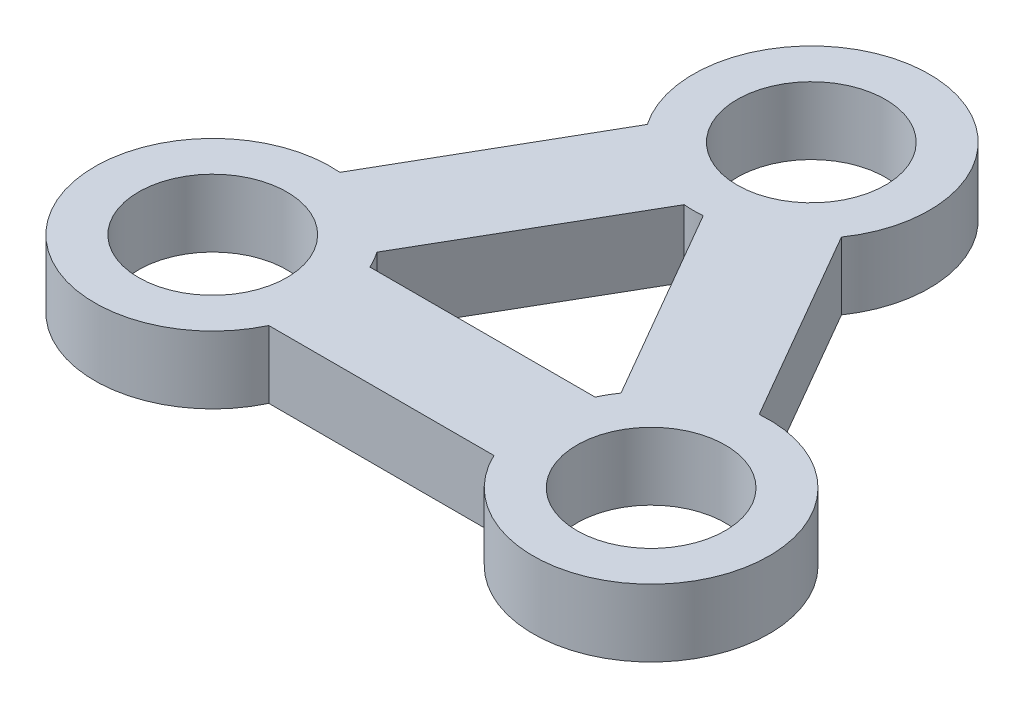
ISO-10303-21;
HEADER;
FILE_DESCRIPTION(('STEP AP214'),'2;1');
FILE_NAME('part.step','',(''),(''),'','','');
FILE_SCHEMA(('AUTOMOTIVE_DESIGN { 1 0 10303 214 1 1 1 1 }'));
ENDSEC;
DATA;
#1=APPLICATION_CONTEXT('core data for automotive mechanical design processes');
#2=APPLICATION_PROTOCOL_DEFINITION('international standard','automotive_design',2000,#1);
#3=PRODUCT_CONTEXT('',#1,'mechanical');
#4=PRODUCT('Part','Part','',(#3));
#5=PRODUCT_RELATED_PRODUCT_CATEGORY('part','',(#4));
#6=PRODUCT_DEFINITION_FORMATION('','',#4);
#7=PRODUCT_DEFINITION_CONTEXT('part definition',#1,'design');
#8=PRODUCT_DEFINITION('design','',#6,#7);
#9=PRODUCT_DEFINITION_SHAPE('','',#8);
#10=(LENGTH_UNIT() NAMED_UNIT(*) SI_UNIT(.MILLI.,.METRE.));
#11=(NAMED_UNIT(*) PLANE_ANGLE_UNIT() SI_UNIT($,.RADIAN.));
#12=(NAMED_UNIT(*) SI_UNIT($,.STERADIAN.) SOLID_ANGLE_UNIT());
#13=UNCERTAINTY_MEASURE_WITH_UNIT(LENGTH_MEASURE(1.E-05),#10,'distance_accuracy_value','');
#14=(GEOMETRIC_REPRESENTATION_CONTEXT(3) GLOBAL_UNCERTAINTY_ASSIGNED_CONTEXT((#13)) GLOBAL_UNIT_ASSIGNED_CONTEXT((#10,
#11,#12)) REPRESENTATION_CONTEXT('',''));
#15=CARTESIAN_POINT('',(0.,0.,0.));
#16=DIRECTION('',(0.,0.,1.));
#17=DIRECTION('',(1.,0.,0.));
#18=AXIS2_PLACEMENT_3D('',#15,#16,#17);
#19=CARTESIAN_POINT('',(0.,20.,0.));
#20=DIRECTION('',(0.,1.,0.));
#21=DIRECTION('',(0.,0.,1.));
#22=AXIS2_PLACEMENT_3D('',#19,#20,#21);
#23=PLANE('',#22);
#24=CARTESIAN_POINT('',(130.,20.,0.));
#25=DIRECTION('',(0.,1.,0.));
#26=DIRECTION('',(0.,0.,1.));
#27=AXIS2_PLACEMENT_3D('',#24,#25,#26);
#28=CIRCLE('',#27,22.);
#29=CARTESIAN_POINT('',(130.,20.,22.));
#30=VERTEX_POINT('',#29);
#31=EDGE_CURVE('E183',#30,#30,#28,.T.);
#32=ORIENTED_EDGE('',*,*,#31,.F.);
#33=EDGE_LOOP('',(#32));
#34=FACE_BOUND('',#33,.T.);
#35=CARTESIAN_POINT('',(0.,20.,0.));
#36=DIRECTION('',(0.,1.,0.));
#37=DIRECTION('',(0.,0.,1.));
#38=AXIS2_PLACEMENT_3D('',#35,#36,#37);
#39=CIRCLE('',#38,35.);
#40=CARTESIAN_POINT('',(2.83219061774813,20.,-34.8852217465324));
#41=VERTEX_POINT('',#40);
#42=CARTESIAN_POINT('',(31.6227766016838,20.,15.));
#43=VERTEX_POINT('',#42);
#44=EDGE_CURVE('E195',#41,#43,#39,.T.);
#45=ORIENTED_EDGE('',*,*,#44,.T.);
#46=DIRECTION('',(1.,0.,0.));
#47=VECTOR('',#46,1.);
#48=CARTESIAN_POINT('',(98.3772233983162,20.,15.));
#49=LINE('',#48,#47);
#50=CARTESIAN_POINT('',(98.3772233983162,20.,15.));
#51=VERTEX_POINT('',#50);
#52=EDGE_CURVE('E198',#43,#51,#49,.T.);
#53=ORIENTED_EDGE('',*,*,#52,.T.);
#54=CARTESIAN_POINT('',(130.,20.,0.));
#55=DIRECTION('',(0.,1.,0.));
#56=DIRECTION('',(0.,0.,1.));
#57=AXIS2_PLACEMENT_3D('',#54,#55,#56);
#58=CIRCLE('',#57,35.);
#59=CARTESIAN_POINT('',(127.167809382252,20.,-34.8852217465324));
#60=VERTEX_POINT('',#59);
#61=EDGE_CURVE('E201',#51,#60,#58,.T.);
#62=ORIENTED_EDGE('',*,*,#61,.T.);
#63=DIRECTION('',(-0.500277597874629,0.,-0.865865073244551));
#64=VECTOR('',#63,1.);
#65=CARTESIAN_POINT('',(93.8081428150846,20.,-92.6231061897065));
#66=LINE('',#65,#64);
#67=CARTESIAN_POINT('',(93.8081428150847,20.,-92.6231061897064));
#68=VERTEX_POINT('',#67);
#69=EDGE_CURVE('E203',#60,#68,#66,.T.);
#70=ORIENTED_EDGE('',*,*,#69,.T.);
#71=CARTESIAN_POINT('',(65.,20.,-112.5));
#72=DIRECTION('',(0.,1.,0.));
#73=DIRECTION('',(0.,0.,1.));
#74=AXIS2_PLACEMENT_3D('',#71,#72,#73);
#75=CIRCLE('',#74,35.);
#76=CARTESIAN_POINT('',(36.0973000328435,20.,-92.7608527385671));
#77=VERTEX_POINT('',#76);
#78=EDGE_CURVE('E205',#68,#77,#75,.T.);
#79=ORIENTED_EDGE('',*,*,#78,.T.);
#80=DIRECTION('',(-0.498320501650439,0.,0.866992893647263));
#81=VECTOR('',#80,1.);
#82=CARTESIAN_POINT('',(2.83219061774813,20.,-34.8852217465324));
#83=LINE('',#82,#81);
#84=EDGE_CURVE('E207',#77,#41,#83,.T.);
#85=ORIENTED_EDGE('',*,*,#84,.T.);
#86=EDGE_LOOP('',(#45,#53,#62,#70,#79,#85));
#87=FACE_BOUND('',#86,.T.);
#88=CARTESIAN_POINT('',(0.,20.,0.));
#89=DIRECTION('',(0.,1.,0.));
#90=DIRECTION('',(0.,0.,1.));
#91=AXIS2_PLACEMENT_3D('',#88,#89,#90);
#92=CIRCLE('',#91,22.);
#93=CARTESIAN_POINT('',(0.,20.,22.));
#94=VERTEX_POINT('',#93);
#95=EDGE_CURVE('E189',#94,#94,#92,.T.);
#96=ORIENTED_EDGE('',*,*,#95,.F.);
#97=EDGE_LOOP('',(#96));
#98=FACE_BOUND('',#97,.T.);
#99=CARTESIAN_POINT('',(65.,20.,-112.5));
#100=DIRECTION('',(0.,1.,0.));
#101=DIRECTION('',(0.,0.,1.));
#102=AXIS2_PLACEMENT_3D('',#99,#100,#101);
#103=CIRCLE('',#102,22.);
#104=CARTESIAN_POINT('',(65.,20.,-90.5));
#105=VERTEX_POINT('',#104);
#106=EDGE_CURVE('E177',#105,#105,#103,.T.);
#107=ORIENTED_EDGE('',*,*,#106,.F.);
#108=EDGE_LOOP('',(#107));
#109=FACE_BOUND('',#108,.T.);
#110=DIRECTION('',(1.,0.,0.));
#111=VECTOR('',#110,1.);
#112=CARTESIAN_POINT('',(98.3772233983162,20.,-15.));
#113=LINE('',#112,#111);
#114=CARTESIAN_POINT('',(31.6227766016838,20.,-15.));
#115=VERTEX_POINT('',#114);
#116=CARTESIAN_POINT('',(98.3772233983162,20.,-15.));
#117=VERTEX_POINT('',#116);
#118=EDGE_CURVE('E134',#115,#117,#113,.T.);
#119=ORIENTED_EDGE('',*,*,#118,.F.);
#120=CARTESIAN_POINT('',(0.,20.,0.));
#121=DIRECTION('',(0.,-1.,0.));
#122=DIRECTION('',(0.,0.,1.));
#123=AXIS2_PLACEMENT_3D('',#120,#121,#122);
#124=CIRCLE('',#123,35.);
#125=CARTESIAN_POINT('',(28.8081428150847,20.,-19.8768938102936));
#126=VERTEX_POINT('',#125);
#127=EDGE_CURVE('E126',#126,#115,#124,.T.);
#128=ORIENTED_EDGE('',*,*,#127,.F.);
#129=DIRECTION('',(-0.500277597874629,0.,0.865865073244551));
#130=VECTOR('',#129,1.);
#131=CARTESIAN_POINT('',(28.8081428150847,20.,-19.8768938102936));
#132=LINE('',#131,#130);
#133=CARTESIAN_POINT('',(62.1678093822518,20.,-77.6147782534676));
#134=VERTEX_POINT('',#133);
#135=EDGE_CURVE('E155',#134,#126,#132,.T.);
#136=ORIENTED_EDGE('',*,*,#135,.F.);
#137=CARTESIAN_POINT('',(65.,20.,-112.5));
#138=DIRECTION('',(0.,-1.,0.));
#139=DIRECTION('',(0.,0.,1.));
#140=AXIS2_PLACEMENT_3D('',#137,#138,#139);
#141=CIRCLE('',#140,35.);
#142=CARTESIAN_POINT('',(67.8321906177481,20.,-77.6147782534676));
#143=VERTEX_POINT('',#142);
#144=EDGE_CURVE('E153',#143,#134,#141,.T.);
#145=ORIENTED_EDGE('',*,*,#144,.F.);
#146=DIRECTION('',(-0.500277597874629,0.,-0.86586507324455));
#147=VECTOR('',#146,1.);
#148=CARTESIAN_POINT('',(67.8321906177481,20.,-77.6147782534676));
#149=LINE('',#148,#147);
#150=CARTESIAN_POINT('',(101.191857184915,20.,-19.8768938102936));
#151=VERTEX_POINT('',#150);
#152=EDGE_CURVE('E149',#151,#143,#149,.T.);
#153=ORIENTED_EDGE('',*,*,#152,.F.);
#154=CARTESIAN_POINT('',(130.,20.,0.));
#155=DIRECTION('',(0.,-1.,0.));
#156=DIRECTION('',(0.,0.,1.));
#157=AXIS2_PLACEMENT_3D('',#154,#155,#156);
#158=CIRCLE('',#157,35.);
#159=EDGE_CURVE('E147',#117,#151,#158,.T.);
#160=ORIENTED_EDGE('',*,*,#159,.F.);
#161=EDGE_LOOP('',(#119,#128,#136,#145,#153,#160));
#162=FACE_BOUND('',#161,.T.);
#163=ADVANCED_FACE('F37',(#34,#87,#98,#109,#162),#23,.T.);
#164=CARTESIAN_POINT('',(0.,0.,0.));
#165=DIRECTION('',(0.,1.,0.));
#166=DIRECTION('',(0.,0.,1.));
#167=AXIS2_PLACEMENT_3D('',#164,#165,#166);
#168=PLANE('',#167);
#169=CARTESIAN_POINT('',(65.,0.,-112.5));
#170=DIRECTION('',(0.,1.,0.));
#171=DIRECTION('',(0.,0.,1.));
#172=AXIS2_PLACEMENT_3D('',#169,#170,#171);
#173=CIRCLE('',#172,22.);
#174=CARTESIAN_POINT('',(65.,0.,-90.5));
#175=VERTEX_POINT('',#174);
#176=EDGE_CURVE('E142',#175,#175,#173,.T.);
#177=ORIENTED_EDGE('',*,*,#176,.T.);
#178=EDGE_LOOP('',(#177));
#179=FACE_BOUND('',#178,.T.);
#180=CARTESIAN_POINT('',(130.,0.,0.));
#181=DIRECTION('',(0.,1.,0.));
#182=DIRECTION('',(0.,0.,1.));
#183=AXIS2_PLACEMENT_3D('',#180,#181,#182);
#184=CIRCLE('',#183,22.);
#185=CARTESIAN_POINT('',(130.,0.,22.));
#186=VERTEX_POINT('',#185);
#187=EDGE_CURVE('E180',#186,#186,#184,.T.);
#188=ORIENTED_EDGE('',*,*,#187,.T.);
#189=EDGE_LOOP('',(#188));
#190=FACE_BOUND('',#189,.T.);
#191=CARTESIAN_POINT('',(0.,0.,0.));
#192=DIRECTION('',(0.,1.,0.));
#193=DIRECTION('',(0.,0.,1.));
#194=AXIS2_PLACEMENT_3D('',#191,#192,#193);
#195=CIRCLE('',#194,22.);
#196=CARTESIAN_POINT('',(0.,0.,22.));
#197=VERTEX_POINT('',#196);
#198=EDGE_CURVE('E186',#197,#197,#195,.T.);
#199=ORIENTED_EDGE('',*,*,#198,.T.);
#200=EDGE_LOOP('',(#199));
#201=FACE_BOUND('',#200,.T.);
#202=CARTESIAN_POINT('',(0.,0.,0.));
#203=DIRECTION('',(0.,1.,0.));
#204=DIRECTION('',(0.,0.,1.));
#205=AXIS2_PLACEMENT_3D('',#202,#203,#204);
#206=CIRCLE('',#205,35.);
#207=CARTESIAN_POINT('',(2.83219061774813,0.,-34.8852217465324));
#208=VERTEX_POINT('',#207);
#209=CARTESIAN_POINT('',(31.6227766016838,0.,15.));
#210=VERTEX_POINT('',#209);
#211=EDGE_CURVE('E192',#208,#210,#206,.T.);
#212=ORIENTED_EDGE('',*,*,#211,.F.);
#213=DIRECTION('',(-0.498320501650439,0.,0.866992893647263));
#214=VECTOR('',#213,1.);
#215=CARTESIAN_POINT('',(2.83219061774813,0.,-34.8852217465324));
#216=LINE('',#215,#214);
#217=CARTESIAN_POINT('',(36.0973000328435,0.,-92.7608527385671));
#218=VERTEX_POINT('',#217);
#219=EDGE_CURVE('E199',#218,#208,#216,.T.);
#220=ORIENTED_EDGE('',*,*,#219,.F.);
#221=CARTESIAN_POINT('',(65.,0.,-112.5));
#222=DIRECTION('',(0.,1.,0.));
#223=DIRECTION('',(0.,0.,1.));
#224=AXIS2_PLACEMENT_3D('',#221,#222,#223);
#225=CIRCLE('',#224,35.);
#226=CARTESIAN_POINT('',(93.8081428150847,0.,-92.6231061897064));
#227=VERTEX_POINT('',#226);
#228=EDGE_CURVE('E218',#227,#218,#225,.T.);
#229=ORIENTED_EDGE('',*,*,#228,.F.);
#230=DIRECTION('',(-0.500277597874629,0.,-0.865865073244551));
#231=VECTOR('',#230,1.);
#232=CARTESIAN_POINT('',(93.8081428150846,0.,-92.6231061897065));
#233=LINE('',#232,#231);
#234=CARTESIAN_POINT('',(127.167809382252,0.,-34.8852217465324));
#235=VERTEX_POINT('',#234);
#236=EDGE_CURVE('E216',#235,#227,#233,.T.);
#237=ORIENTED_EDGE('',*,*,#236,.F.);
#238=CARTESIAN_POINT('',(130.,0.,0.));
#239=DIRECTION('',(0.,1.,0.));
#240=DIRECTION('',(0.,0.,1.));
#241=AXIS2_PLACEMENT_3D('',#238,#239,#240);
#242=CIRCLE('',#241,35.);
#243=CARTESIAN_POINT('',(98.3772233983162,0.,15.));
#244=VERTEX_POINT('',#243);
#245=EDGE_CURVE('E214',#244,#235,#242,.T.);
#246=ORIENTED_EDGE('',*,*,#245,.F.);
#247=DIRECTION('',(1.,0.,0.));
#248=VECTOR('',#247,1.);
#249=CARTESIAN_POINT('',(98.3772233983162,0.,15.));
#250=LINE('',#249,#248);
#251=EDGE_CURVE('E212',#210,#244,#250,.T.);
#252=ORIENTED_EDGE('',*,*,#251,.F.);
#253=EDGE_LOOP('',(#212,#220,#229,#237,#246,#252));
#254=FACE_BOUND('',#253,.T.);
#255=CARTESIAN_POINT('',(0.,0.,0.));
#256=DIRECTION('',(0.,-1.,0.));
#257=DIRECTION('',(0.,0.,1.));
#258=AXIS2_PLACEMENT_3D('',#255,#256,#257);
#259=CIRCLE('',#258,35.);
#260=CARTESIAN_POINT('',(28.8081428150847,0.,-19.8768938102936));
#261=VERTEX_POINT('',#260);
#262=CARTESIAN_POINT('',(31.6227766016838,0.,-15.));
#263=VERTEX_POINT('',#262);
#264=EDGE_CURVE('E60',#261,#263,#259,.T.);
#265=ORIENTED_EDGE('',*,*,#264,.T.);
#266=DIRECTION('',(1.,0.,0.));
#267=VECTOR('',#266,1.);
#268=CARTESIAN_POINT('',(98.3772233983162,0.,-15.));
#269=LINE('',#268,#267);
#270=CARTESIAN_POINT('',(98.3772233983162,0.,-15.));
#271=VERTEX_POINT('',#270);
#272=EDGE_CURVE('E141',#263,#271,#269,.T.);
#273=ORIENTED_EDGE('',*,*,#272,.T.);
#274=CARTESIAN_POINT('',(130.,0.,0.));
#275=DIRECTION('',(0.,-1.,0.));
#276=DIRECTION('',(0.,0.,1.));
#277=AXIS2_PLACEMENT_3D('',#274,#275,#276);
#278=CIRCLE('',#277,35.);
#279=CARTESIAN_POINT('',(101.191857184915,0.,-19.8768938102936));
#280=VERTEX_POINT('',#279);
#281=EDGE_CURVE('E159',#271,#280,#278,.T.);
#282=ORIENTED_EDGE('',*,*,#281,.T.);
#283=DIRECTION('',(-0.500277597874629,0.,-0.86586507324455));
#284=VECTOR('',#283,1.);
#285=CARTESIAN_POINT('',(67.8321906177481,0.,-77.6147782534676));
#286=LINE('',#285,#284);
#287=CARTESIAN_POINT('',(67.8321906177481,0.,-77.6147782534676));
#288=VERTEX_POINT('',#287);
#289=EDGE_CURVE('E162',#280,#288,#286,.T.);
#290=ORIENTED_EDGE('',*,*,#289,.T.);
#291=CARTESIAN_POINT('',(65.,0.,-112.5));
#292=DIRECTION('',(0.,-1.,0.));
#293=DIRECTION('',(0.,0.,1.));
#294=AXIS2_PLACEMENT_3D('',#291,#292,#293);
#295=CIRCLE('',#294,35.);
#296=CARTESIAN_POINT('',(62.1678093822518,0.,-77.6147782534676));
#297=VERTEX_POINT('',#296);
#298=EDGE_CURVE('E165',#288,#297,#295,.T.);
#299=ORIENTED_EDGE('',*,*,#298,.T.);
#300=DIRECTION('',(-0.500277597874629,0.,0.865865073244551));
#301=VECTOR('',#300,1.);
#302=CARTESIAN_POINT('',(28.8081428150847,0.,-19.8768938102936));
#303=LINE('',#302,#301);
#304=EDGE_CURVE('E135',#297,#261,#303,.T.);
#305=ORIENTED_EDGE('',*,*,#304,.T.);
#306=EDGE_LOOP('',(#265,#273,#282,#290,#299,#305));
#307=FACE_BOUND('',#306,.T.);
#308=ADVANCED_FACE('F242',(#179,#190,#201,#254,#307),#168,.F.);
#309=CARTESIAN_POINT('',(0.,20.,0.));
#310=DIRECTION('',(0.,-1.,0.));
#311=DIRECTION('',(0.,0.,-1.));
#312=AXIS2_PLACEMENT_3D('',#309,#310,#311);
#313=CYLINDRICAL_SURFACE('',#312,35.);
#314=ORIENTED_EDGE('',*,*,#211,.T.);
#315=DIRECTION('',(0.,-1.,0.));
#316=VECTOR('',#315,1.);
#317=CARTESIAN_POINT('',(31.6227766016838,20.,15.));
#318=LINE('',#317,#316);
#319=EDGE_CURVE('E11',#43,#210,#318,.T.);
#320=ORIENTED_EDGE('',*,*,#319,.F.);
#321=ORIENTED_EDGE('',*,*,#44,.F.);
#322=DIRECTION('',(0.,-1.,0.));
#323=VECTOR('',#322,1.);
#324=CARTESIAN_POINT('',(2.83219061774813,20.,-34.8852217465324));
#325=LINE('',#324,#323);
#326=EDGE_CURVE('E209',#41,#208,#325,.T.);
#327=ORIENTED_EDGE('',*,*,#326,.T.);
#328=EDGE_LOOP('',(#314,#320,#321,#327));
#329=FACE_BOUND('',#328,.T.);
#330=ADVANCED_FACE('F39',(#329),#313,.T.);
#331=CARTESIAN_POINT('',(98.3772233983162,20.,15.));
#332=DIRECTION('',(0.,0.,-1.));
#333=DIRECTION('',(-1.,0.,0.));
#334=AXIS2_PLACEMENT_3D('',#331,#332,#333);
#335=PLANE('',#334);
#336=ORIENTED_EDGE('',*,*,#251,.T.);
#337=DIRECTION('',(0.,-1.,0.));
#338=VECTOR('',#337,1.);
#339=CARTESIAN_POINT('',(98.3772233983162,20.,15.));
#340=LINE('',#339,#338);
#341=EDGE_CURVE('E45',#51,#244,#340,.T.);
#342=ORIENTED_EDGE('',*,*,#341,.F.);
#343=ORIENTED_EDGE('',*,*,#52,.F.);
#344=ORIENTED_EDGE('',*,*,#319,.T.);
#345=EDGE_LOOP('',(#336,#342,#343,#344));
#346=FACE_BOUND('',#345,.T.);
#347=ADVANCED_FACE('F260',(#346),#335,.F.);
#348=CARTESIAN_POINT('',(130.,20.,0.));
#349=DIRECTION('',(0.,-1.,0.));
#350=DIRECTION('',(0.,0.,-1.));
#351=AXIS2_PLACEMENT_3D('',#348,#349,#350);
#352=CYLINDRICAL_SURFACE('',#351,35.);
#353=ORIENTED_EDGE('',*,*,#245,.T.);
#354=DIRECTION('',(0.,-1.,0.));
#355=VECTOR('',#354,1.);
#356=CARTESIAN_POINT('',(127.167809382252,20.,-34.8852217465324));
#357=LINE('',#356,#355);
#358=EDGE_CURVE('E229',#60,#235,#357,.T.);
#359=ORIENTED_EDGE('',*,*,#358,.F.);
#360=ORIENTED_EDGE('',*,*,#61,.F.);
#361=ORIENTED_EDGE('',*,*,#341,.T.);
#362=EDGE_LOOP('',(#353,#359,#360,#361));
#363=FACE_BOUND('',#362,.T.);
#364=ADVANCED_FACE('F236',(#363),#352,.T.);
#365=CARTESIAN_POINT('',(93.8081428150846,20.,-92.6231061897065));
#366=DIRECTION('',(-0.865865073244551,0.,0.500277597874629));
#367=DIRECTION('',(0.500277597874629,0.,0.865865073244551));
#368=AXIS2_PLACEMENT_3D('',#365,#366,#367);
#369=PLANE('',#368);
#370=ORIENTED_EDGE('',*,*,#236,.T.);
#371=DIRECTION('',(0.,-1.,0.));
#372=VECTOR('',#371,1.);
#373=CARTESIAN_POINT('',(93.8081428150847,20.,-92.6231061897064));
#374=LINE('',#373,#372);
#375=EDGE_CURVE('E226',#68,#227,#374,.T.);
#376=ORIENTED_EDGE('',*,*,#375,.F.);
#377=ORIENTED_EDGE('',*,*,#69,.F.);
#378=ORIENTED_EDGE('',*,*,#358,.T.);
#379=EDGE_LOOP('',(#370,#376,#377,#378));
#380=FACE_BOUND('',#379,.T.);
#381=ADVANCED_FACE('F248',(#380),#369,.F.);
#382=CARTESIAN_POINT('',(65.,20.,-112.5));
#383=DIRECTION('',(0.,-1.,0.));
#384=DIRECTION('',(0.,0.,-1.));
#385=AXIS2_PLACEMENT_3D('',#382,#383,#384);
#386=CYLINDRICAL_SURFACE('',#385,35.);
#387=ORIENTED_EDGE('',*,*,#228,.T.);
#388=DIRECTION('',(0.,-1.,0.));
#389=VECTOR('',#388,1.);
#390=CARTESIAN_POINT('',(36.0973000328435,20.,-92.7608527385671));
#391=LINE('',#390,#389);
#392=EDGE_CURVE('E223',#77,#218,#391,.T.);
#393=ORIENTED_EDGE('',*,*,#392,.F.);
#394=ORIENTED_EDGE('',*,*,#78,.F.);
#395=ORIENTED_EDGE('',*,*,#375,.T.);
#396=EDGE_LOOP('',(#387,#393,#394,#395));
#397=FACE_BOUND('',#396,.T.);
#398=ADVANCED_FACE('F252',(#397),#386,.T.);
#399=CARTESIAN_POINT('',(2.83219061774813,20.,-34.8852217465324));
#400=DIRECTION('',(0.866992893647263,0.,0.498320501650439));
#401=DIRECTION('',(0.498320501650439,0.,-0.866992893647263));
#402=AXIS2_PLACEMENT_3D('',#399,#400,#401);
#403=PLANE('',#402);
#404=ORIENTED_EDGE('',*,*,#219,.T.);
#405=ORIENTED_EDGE('',*,*,#326,.F.);
#406=ORIENTED_EDGE('',*,*,#84,.F.);
#407=ORIENTED_EDGE('',*,*,#392,.T.);
#408=EDGE_LOOP('',(#404,#405,#406,#407));
#409=FACE_BOUND('',#408,.T.);
#410=ADVANCED_FACE('F263',(#409),#403,.F.);
#411=CARTESIAN_POINT('',(0.,20.,0.));
#412=DIRECTION('',(0.,-1.,0.));
#413=DIRECTION('',(0.,0.,-1.));
#414=AXIS2_PLACEMENT_3D('',#411,#412,#413);
#415=CYLINDRICAL_SURFACE('',#414,22.);
#416=ORIENTED_EDGE('',*,*,#95,.T.);
#417=EDGE_LOOP('',(#416));
#418=FACE_BOUND('',#417,.T.);
#419=ORIENTED_EDGE('',*,*,#198,.F.);
#420=EDGE_LOOP('',(#419));
#421=FACE_BOUND('',#420,.T.);
#422=ADVANCED_FACE('F265',(#418,#421),#415,.F.);
#423=CARTESIAN_POINT('',(130.,20.,0.));
#424=DIRECTION('',(0.,-1.,0.));
#425=DIRECTION('',(0.,0.,-1.));
#426=AXIS2_PLACEMENT_3D('',#423,#424,#425);
#427=CYLINDRICAL_SURFACE('',#426,22.);
#428=ORIENTED_EDGE('',*,*,#31,.T.);
#429=EDGE_LOOP('',(#428));
#430=FACE_BOUND('',#429,.T.);
#431=ORIENTED_EDGE('',*,*,#187,.F.);
#432=EDGE_LOOP('',(#431));
#433=FACE_BOUND('',#432,.T.);
#434=ADVANCED_FACE('F271',(#430,#433),#427,.F.);
#435=CARTESIAN_POINT('',(65.,20.,-112.5));
#436=DIRECTION('',(0.,-1.,0.));
#437=DIRECTION('',(0.,0.,-1.));
#438=AXIS2_PLACEMENT_3D('',#435,#436,#437);
#439=CYLINDRICAL_SURFACE('',#438,22.);
#440=ORIENTED_EDGE('',*,*,#106,.T.);
#441=EDGE_LOOP('',(#440));
#442=FACE_BOUND('',#441,.T.);
#443=ORIENTED_EDGE('',*,*,#176,.F.);
#444=EDGE_LOOP('',(#443));
#445=FACE_BOUND('',#444,.T.);
#446=ADVANCED_FACE('F287',(#442,#445),#439,.F.);
#447=CARTESIAN_POINT('',(0.,20.,0.));
#448=DIRECTION('',(0.,-1.,0.));
#449=DIRECTION('',(0.,0.,-1.));
#450=AXIS2_PLACEMENT_3D('',#447,#448,#449);
#451=CYLINDRICAL_SURFACE('',#450,35.);
#452=ORIENTED_EDGE('',*,*,#264,.F.);
#453=DIRECTION('',(0.,-1.,0.));
#454=VECTOR('',#453,1.);
#455=CARTESIAN_POINT('',(28.8081428150847,20.,-19.8768938102936));
#456=LINE('',#455,#454);
#457=EDGE_CURVE('E130',#126,#261,#456,.T.);
#458=ORIENTED_EDGE('',*,*,#457,.F.);
#459=ORIENTED_EDGE('',*,*,#127,.T.);
#460=DIRECTION('',(0.,-1.,0.));
#461=VECTOR('',#460,1.);
#462=CARTESIAN_POINT('',(31.6227766016838,20.,-15.));
#463=LINE('',#462,#461);
#464=EDGE_CURVE('E129',#115,#263,#463,.T.);
#465=ORIENTED_EDGE('',*,*,#464,.T.);
#466=EDGE_LOOP('',(#452,#458,#459,#465));
#467=FACE_BOUND('',#466,.T.);
#468=ADVANCED_FACE('F128',(#467),#451,.T.);
#469=CARTESIAN_POINT('',(98.3772233983162,20.,-15.));
#470=DIRECTION('',(0.,0.,-1.));
#471=DIRECTION('',(-1.,0.,0.));
#472=AXIS2_PLACEMENT_3D('',#469,#470,#471);
#473=PLANE('',#472);
#474=ORIENTED_EDGE('',*,*,#272,.F.);
#475=ORIENTED_EDGE('',*,*,#464,.F.);
#476=ORIENTED_EDGE('',*,*,#118,.T.);
#477=DIRECTION('',(0.,-1.,0.));
#478=VECTOR('',#477,1.);
#479=CARTESIAN_POINT('',(98.3772233983162,20.,-15.));
#480=LINE('',#479,#478);
#481=EDGE_CURVE('E143',#117,#271,#480,.T.);
#482=ORIENTED_EDGE('',*,*,#481,.T.);
#483=EDGE_LOOP('',(#474,#475,#476,#482));
#484=FACE_BOUND('',#483,.T.);
#485=ADVANCED_FACE('F138',(#484),#473,.T.);
#486=CARTESIAN_POINT('',(130.,20.,0.));
#487=DIRECTION('',(0.,-1.,0.));
#488=DIRECTION('',(0.,0.,-1.));
#489=AXIS2_PLACEMENT_3D('',#486,#487,#488);
#490=CYLINDRICAL_SURFACE('',#489,35.);
#491=ORIENTED_EDGE('',*,*,#281,.F.);
#492=ORIENTED_EDGE('',*,*,#481,.F.);
#493=ORIENTED_EDGE('',*,*,#159,.T.);
#494=DIRECTION('',(0.,-1.,0.));
#495=VECTOR('',#494,1.);
#496=CARTESIAN_POINT('',(101.191857184915,20.,-19.8768938102936));
#497=LINE('',#496,#495);
#498=EDGE_CURVE('E174',#151,#280,#497,.T.);
#499=ORIENTED_EDGE('',*,*,#498,.T.);
#500=EDGE_LOOP('',(#491,#492,#493,#499));
#501=FACE_BOUND('',#500,.T.);
#502=ADVANCED_FACE('F296',(#501),#490,.T.);
#503=CARTESIAN_POINT('',(67.8321906177481,20.,-77.6147782534676));
#504=DIRECTION('',(-0.86586507324455,0.,0.500277597874629));
#505=DIRECTION('',(0.500277597874629,0.,0.86586507324455));
#506=AXIS2_PLACEMENT_3D('',#503,#504,#505);
#507=PLANE('',#506);
#508=ORIENTED_EDGE('',*,*,#289,.F.);
#509=ORIENTED_EDGE('',*,*,#498,.F.);
#510=ORIENTED_EDGE('',*,*,#152,.T.);
#511=DIRECTION('',(0.,-1.,0.));
#512=VECTOR('',#511,1.);
#513=CARTESIAN_POINT('',(67.8321906177481,20.,-77.6147782534676));
#514=LINE('',#513,#512);
#515=EDGE_CURVE('E172',#143,#288,#514,.T.);
#516=ORIENTED_EDGE('',*,*,#515,.T.);
#517=EDGE_LOOP('',(#508,#509,#510,#516));
#518=FACE_BOUND('',#517,.T.);
#519=ADVANCED_FACE('F299',(#518),#507,.T.);
#520=CARTESIAN_POINT('',(65.,20.,-112.5));
#521=DIRECTION('',(0.,-1.,0.));
#522=DIRECTION('',(0.,0.,-1.));
#523=AXIS2_PLACEMENT_3D('',#520,#521,#522);
#524=CYLINDRICAL_SURFACE('',#523,35.);
#525=ORIENTED_EDGE('',*,*,#298,.F.);
#526=ORIENTED_EDGE('',*,*,#515,.F.);
#527=ORIENTED_EDGE('',*,*,#144,.T.);
#528=DIRECTION('',(0.,-1.,0.));
#529=VECTOR('',#528,1.);
#530=CARTESIAN_POINT('',(62.1678093822518,20.,-77.6147782534676));
#531=LINE('',#530,#529);
#532=EDGE_CURVE('E52',#134,#297,#531,.T.);
#533=ORIENTED_EDGE('',*,*,#532,.T.);
#534=EDGE_LOOP('',(#525,#526,#527,#533));
#535=FACE_BOUND('',#534,.T.);
#536=ADVANCED_FACE('F303',(#535),#524,.T.);
#537=CARTESIAN_POINT('',(28.8081428150847,20.,-19.8768938102936));
#538=DIRECTION('',(0.865865073244551,0.,0.500277597874629));
#539=DIRECTION('',(0.500277597874629,0.,-0.865865073244551));
#540=AXIS2_PLACEMENT_3D('',#537,#538,#539);
#541=PLANE('',#540);
#542=ORIENTED_EDGE('',*,*,#304,.F.);
#543=ORIENTED_EDGE('',*,*,#532,.F.);
#544=ORIENTED_EDGE('',*,*,#135,.T.);
#545=ORIENTED_EDGE('',*,*,#457,.T.);
#546=EDGE_LOOP('',(#542,#543,#544,#545));
#547=FACE_BOUND('',#546,.T.);
#548=ADVANCED_FACE('F307',(#547),#541,.T.);
#549=CLOSED_SHELL('',(#163,#308,#330,#347,#364,#381,#398,#410,#422,#434,#446,#468,#485,#502,
#519,#536,#548));
#550=MANIFOLD_SOLID_BREP('B2',#549);
#551=ADVANCED_BREP_SHAPE_REPRESENTATION('',(#18,#550),#14);
#552=SHAPE_DEFINITION_REPRESENTATION(#9,#551);
ENDSEC;
END-ISO-10303-21;
